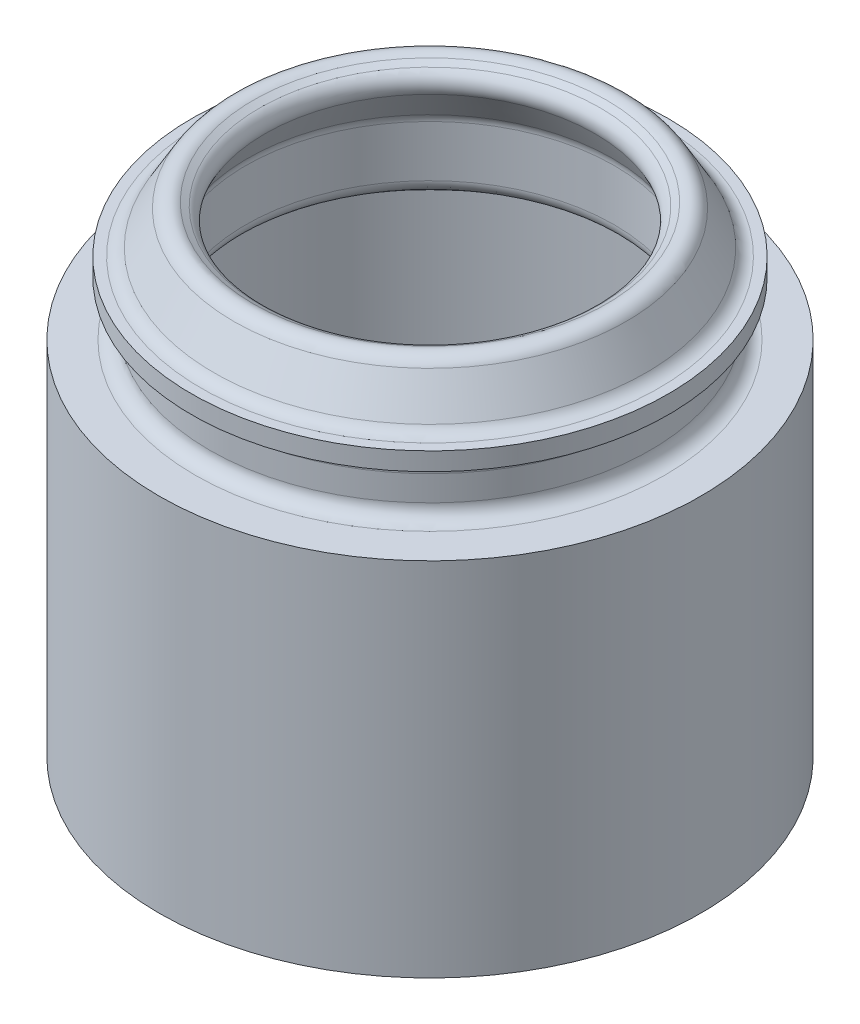
ISO-10303-21;
HEADER;
FILE_DESCRIPTION(('STEP AP214'),'2;1');
FILE_NAME('part.step','',(''),(''),'','','');
FILE_SCHEMA(('AUTOMOTIVE_DESIGN { 1 0 10303 214 1 1 1 1 }'));
ENDSEC;
DATA;
#1=APPLICATION_CONTEXT('core data for automotive mechanical design processes');
#2=APPLICATION_PROTOCOL_DEFINITION('international standard','automotive_design',2000,#1);
#3=PRODUCT_CONTEXT('',#1,'mechanical');
#4=PRODUCT('Part','Part','',(#3));
#5=PRODUCT_RELATED_PRODUCT_CATEGORY('part','',(#4));
#6=PRODUCT_DEFINITION_FORMATION('','',#4);
#7=PRODUCT_DEFINITION_CONTEXT('part definition',#1,'design');
#8=PRODUCT_DEFINITION('design','',#6,#7);
#9=PRODUCT_DEFINITION_SHAPE('','',#8);
#10=(LENGTH_UNIT() NAMED_UNIT(*) SI_UNIT(.MILLI.,.METRE.));
#11=(NAMED_UNIT(*) PLANE_ANGLE_UNIT() SI_UNIT($,.RADIAN.));
#12=(NAMED_UNIT(*) SI_UNIT($,.STERADIAN.) SOLID_ANGLE_UNIT());
#13=UNCERTAINTY_MEASURE_WITH_UNIT(LENGTH_MEASURE(1.E-05),#10,'distance_accuracy_value','');
#14=(GEOMETRIC_REPRESENTATION_CONTEXT(3) GLOBAL_UNCERTAINTY_ASSIGNED_CONTEXT((#13)) GLOBAL_UNIT_ASSIGNED_CONTEXT((#10,
#11,#12)) REPRESENTATION_CONTEXT('',''));
#15=CARTESIAN_POINT('',(0.,0.,0.));
#16=DIRECTION('',(0.,0.,1.));
#17=DIRECTION('',(1.,0.,0.));
#18=AXIS2_PLACEMENT_3D('',#15,#16,#17);
#19=CARTESIAN_POINT('',(0.,10.,0.));
#20=DIRECTION('',(0.,-1.,0.));
#21=DIRECTION('',(0.,0.,-1.));
#22=AXIS2_PLACEMENT_3D('',#19,#20,#21);
#23=CYLINDRICAL_SURFACE('',#22,7.5);
#24=CARTESIAN_POINT('',(0.,10.,0.));
#25=DIRECTION('',(0.,1.,0.));
#26=DIRECTION('',(0.,0.,1.));
#27=AXIS2_PLACEMENT_3D('',#24,#25,#26);
#28=CIRCLE('',#27,7.5);
#29=CARTESIAN_POINT('',(0.,10.,7.5));
#30=VERTEX_POINT('',#29);
#31=EDGE_CURVE('E50',#30,#30,#28,.T.);
#32=ORIENTED_EDGE('',*,*,#31,.F.);
#33=EDGE_LOOP('',(#32));
#34=FACE_BOUND('',#33,.T.);
#35=CARTESIAN_POINT('',(0.,0.,0.));
#36=DIRECTION('',(0.,1.,0.));
#37=DIRECTION('',(0.,0.,1.));
#38=AXIS2_PLACEMENT_3D('',#35,#36,#37);
#39=CIRCLE('',#38,7.5);
#40=CARTESIAN_POINT('',(0.,0.,7.5));
#41=VERTEX_POINT('',#40);
#42=EDGE_CURVE('E55',#41,#41,#39,.T.);
#43=ORIENTED_EDGE('',*,*,#42,.T.);
#44=EDGE_LOOP('',(#43));
#45=FACE_BOUND('',#44,.T.);
#46=ADVANCED_FACE('F43',(#34,#45),#23,.T.);
#47=CARTESIAN_POINT('',(0.,10.,0.));
#48=DIRECTION('',(0.,1.,0.));
#49=DIRECTION('',(0.,0.,1.));
#50=AXIS2_PLACEMENT_3D('',#47,#48,#49);
#51=PLANE('',#50);
#52=CARTESIAN_POINT('',(0.,10.,0.));
#53=DIRECTION('',(0.,1.,0.));
#54=DIRECTION('',(0.,0.,1.));
#55=AXIS2_PLACEMENT_3D('',#52,#53,#54);
#56=CIRCLE('',#55,6.5);
#57=CARTESIAN_POINT('',(0.,10.,6.5));
#58=VERTEX_POINT('',#57);
#59=EDGE_CURVE('E63',#58,#58,#56,.T.);
#60=ORIENTED_EDGE('',*,*,#59,.F.);
#61=EDGE_LOOP('',(#60));
#62=FACE_BOUND('',#61,.T.);
#63=ORIENTED_EDGE('',*,*,#31,.T.);
#64=EDGE_LOOP('',(#63));
#65=FACE_BOUND('',#64,.T.);
#66=ADVANCED_FACE('F225',(#62,#65),#51,.T.);
#67=CARTESIAN_POINT('',(0.,0.,0.));
#68=DIRECTION('',(0.,1.,0.));
#69=DIRECTION('',(0.,0.,1.));
#70=AXIS2_PLACEMENT_3D('',#67,#68,#69);
#71=PLANE('',#70);
#72=ORIENTED_EDGE('',*,*,#42,.F.);
#73=EDGE_LOOP('',(#72));
#74=FACE_BOUND('',#73,.T.);
#75=ADVANCED_FACE('F219',(#74),#71,.F.);
#76=CARTESIAN_POINT('',(0.,9.,0.));
#77=DIRECTION('',(0.,-1.,0.));
#78=DIRECTION('',(0.,0.,-1.));
#79=AXIS2_PLACEMENT_3D('',#76,#77,#78);
#80=CONICAL_SURFACE('',#79,6.5,0.950546840812076);
#81=CARTESIAN_POINT('',(0.,9.88035376963403,0.));
#82=DIRECTION('',(0.,-1.,0.));
#83=DIRECTION('',(0.,0.,-1.));
#84=AXIS2_PLACEMENT_3D('',#81,#82,#83);
#85=CIRCLE('',#84,5.26750472251236);
#86=CARTESIAN_POINT('',(0.,9.88035376963403,-5.26750472251236));
#87=VERTEX_POINT('',#86);
#88=EDGE_CURVE('E67',#87,#87,#85,.T.);
#89=ORIENTED_EDGE('',*,*,#88,.F.);
#90=EDGE_LOOP('',(#89));
#91=FACE_BOUND('',#90,.T.);
#92=CARTESIAN_POINT('',(0.,9.,0.));
#93=DIRECTION('',(0.,-1.,0.));
#94=DIRECTION('',(0.,0.,-1.));
#95=AXIS2_PLACEMENT_3D('',#92,#93,#94);
#96=CIRCLE('',#95,6.5);
#97=CARTESIAN_POINT('',(0.,9.,-6.5));
#98=VERTEX_POINT('',#97);
#99=EDGE_CURVE('E10',#98,#98,#96,.T.);
#100=ORIENTED_EDGE('',*,*,#99,.T.);
#101=EDGE_LOOP('',(#100));
#102=FACE_BOUND('',#101,.T.);
#103=ADVANCED_FACE('F214',(#91,#102),#80,.F.);
#104=CARTESIAN_POINT('',(0.,10.2058471581167,0.));
#105=DIRECTION('',(0.,-1.,0.));
#106=DIRECTION('',(0.,0.,-1.));
#107=AXIS2_PLACEMENT_3D('',#104,#105,#106);
#108=TOROIDAL_SURFACE('',#107,5.5,0.4);
#109=CARTESIAN_POINT('',(0.,10.2058471581167,0.));
#110=DIRECTION('',(0.,-1.,0.));
#111=DIRECTION('',(0.,0.,-1.));
#112=AXIS2_PLACEMENT_3D('',#109,#110,#111);
#113=CIRCLE('',#112,5.1);
#114=CARTESIAN_POINT('',(0.,10.2058471581167,-5.1));
#115=VERTEX_POINT('',#114);
#116=EDGE_CURVE('E74',#115,#115,#113,.T.);
#117=ORIENTED_EDGE('',*,*,#116,.F.);
#118=EDGE_LOOP('',(#117));
#119=FACE_BOUND('',#118,.T.);
#120=ORIENTED_EDGE('',*,*,#88,.T.);
#121=EDGE_LOOP('',(#120));
#122=FACE_BOUND('',#121,.T.);
#123=ADVANCED_FACE('F208',(#119,#122),#108,.T.);
#124=CARTESIAN_POINT('',(0.,1.5,0.));
#125=DIRECTION('',(0.,-1.,0.));
#126=DIRECTION('',(0.,0.,-1.));
#127=AXIS2_PLACEMENT_3D('',#124,#125,#126);
#128=CYLINDRICAL_SURFACE('',#127,5.1);
#129=CARTESIAN_POINT('',(0.,11.6248711305964,0.));
#130=DIRECTION('',(0.,-1.,0.));
#131=DIRECTION('',(0.,0.,-1.));
#132=AXIS2_PLACEMENT_3D('',#129,#130,#131);
#133=CIRCLE('',#132,5.1);
#134=CARTESIAN_POINT('',(0.,11.6248711305964,-5.1));
#135=VERTEX_POINT('',#134);
#136=EDGE_CURVE('E78',#135,#135,#133,.T.);
#137=ORIENTED_EDGE('',*,*,#136,.F.);
#138=EDGE_LOOP('',(#137));
#139=FACE_BOUND('',#138,.T.);
#140=ORIENTED_EDGE('',*,*,#116,.T.);
#141=EDGE_LOOP('',(#140));
#142=FACE_BOUND('',#141,.T.);
#143=ADVANCED_FACE('F202',(#139,#142),#128,.F.);
#144=CARTESIAN_POINT('',(0.,11.6248711305964,0.));
#145=DIRECTION('',(0.,-1.,0.));
#146=DIRECTION('',(0.,0.,-1.));
#147=AXIS2_PLACEMENT_3D('',#144,#145,#146);
#148=TOROIDAL_SURFACE('',#147,4.7,0.400000000000001);
#149=CARTESIAN_POINT('',(0.,11.8248711305964,0.));
#150=DIRECTION('',(0.,-1.,0.));
#151=DIRECTION('',(0.,0.,-1.));
#152=AXIS2_PLACEMENT_3D('',#149,#150,#151);
#153=CIRCLE('',#152,5.04641016151378);
#154=CARTESIAN_POINT('',(0.,11.8248711305964,-5.04641016151378));
#155=VERTEX_POINT('',#154);
#156=EDGE_CURVE('E82',#155,#155,#153,.T.);
#157=ORIENTED_EDGE('',*,*,#156,.F.);
#158=EDGE_LOOP('',(#157));
#159=FACE_BOUND('',#158,.T.);
#160=ORIENTED_EDGE('',*,*,#136,.T.);
#161=EDGE_LOOP('',(#160));
#162=FACE_BOUND('',#161,.T.);
#163=ADVANCED_FACE('F196',(#159,#162),#148,.F.);
#164=CARTESIAN_POINT('',(0.,11.8248711305964,0.));
#165=DIRECTION('',(0.,-1.,0.));
#166=DIRECTION('',(0.,0.,-1.));
#167=AXIS2_PLACEMENT_3D('',#164,#165,#166);
#168=CONICAL_SURFACE('',#167,5.04641016151378,0.523598775598297);
#169=CARTESIAN_POINT('',(0.,12.6535898384862,0.));
#170=DIRECTION('',(0.,-1.,0.));
#171=DIRECTION('',(0.,0.,-1.));
#172=AXIS2_PLACEMENT_3D('',#169,#170,#171);
#173=CIRCLE('',#172,4.56794919243113);
#174=CARTESIAN_POINT('',(0.,12.6535898384862,-4.56794919243113));
#175=VERTEX_POINT('',#174);
#176=EDGE_CURVE('E86',#175,#175,#173,.T.);
#177=ORIENTED_EDGE('',*,*,#176,.F.);
#178=EDGE_LOOP('',(#177));
#179=FACE_BOUND('',#178,.T.);
#180=ORIENTED_EDGE('',*,*,#156,.T.);
#181=EDGE_LOOP('',(#180));
#182=FACE_BOUND('',#181,.T.);
#183=ADVANCED_FACE('F190',(#179,#182),#168,.F.);
#184=CARTESIAN_POINT('',(0.,12.8535898384862,0.));
#185=DIRECTION('',(0.,-1.,0.));
#186=DIRECTION('',(0.,0.,-1.));
#187=AXIS2_PLACEMENT_3D('',#184,#185,#186);
#188=TOROIDAL_SURFACE('',#187,4.9143593539449,0.4);
#189=CARTESIAN_POINT('',(0.,13.2,0.));
#190=DIRECTION('',(0.,-1.,0.));
#191=DIRECTION('',(0.,0.,-1.));
#192=AXIS2_PLACEMENT_3D('',#189,#190,#191);
#193=CIRCLE('',#192,4.7143593539449);
#194=CARTESIAN_POINT('',(0.,13.2,-4.7143593539449));
#195=VERTEX_POINT('',#194);
#196=EDGE_CURVE('E90',#195,#195,#193,.T.);
#197=ORIENTED_EDGE('',*,*,#196,.F.);
#198=EDGE_LOOP('',(#197));
#199=FACE_BOUND('',#198,.T.);
#200=ORIENTED_EDGE('',*,*,#176,.T.);
#201=EDGE_LOOP('',(#200));
#202=FACE_BOUND('',#201,.T.);
#203=ADVANCED_FACE('F184',(#199,#202),#188,.T.);
#204=CARTESIAN_POINT('',(0.,13.2,0.));
#205=DIRECTION('',(0.,1.,0.));
#206=DIRECTION('',(0.,0.,1.));
#207=AXIS2_PLACEMENT_3D('',#204,#205,#206);
#208=CONICAL_SURFACE('',#207,4.7143593539449,1.0471975511966);
#209=CARTESIAN_POINT('',(0.,13.3,0.));
#210=DIRECTION('',(0.,-1.,0.));
#211=DIRECTION('',(0.,0.,-1.));
#212=AXIS2_PLACEMENT_3D('',#209,#210,#211);
#213=CIRCLE('',#212,4.88756443470179);
#214=CARTESIAN_POINT('',(0.,13.3,-4.88756443470179));
#215=VERTEX_POINT('',#214);
#216=EDGE_CURVE('E94',#215,#215,#213,.T.);
#217=ORIENTED_EDGE('',*,*,#216,.F.);
#218=EDGE_LOOP('',(#217));
#219=FACE_BOUND('',#218,.T.);
#220=ORIENTED_EDGE('',*,*,#196,.T.);
#221=EDGE_LOOP('',(#220));
#222=FACE_BOUND('',#221,.T.);
#223=ADVANCED_FACE('F178',(#219,#222),#208,.F.);
#224=CARTESIAN_POINT('',(0.,12.9535898384862,0.));
#225=DIRECTION('',(0.,-1.,0.));
#226=DIRECTION('',(0.,0.,-1.));
#227=AXIS2_PLACEMENT_3D('',#224,#225,#226);
#228=TOROIDAL_SURFACE('',#227,5.08756443470179,0.4);
#229=CARTESIAN_POINT('',(0.,13.1535898384862,0.));
#230=DIRECTION('',(0.,-1.,0.));
#231=DIRECTION('',(0.,0.,-1.));
#232=AXIS2_PLACEMENT_3D('',#229,#230,#231);
#233=CIRCLE('',#232,5.43397459621557);
#234=CARTESIAN_POINT('',(0.,13.1535898384862,-5.43397459621557));
#235=VERTEX_POINT('',#234);
#236=EDGE_CURVE('E98',#235,#235,#233,.T.);
#237=ORIENTED_EDGE('',*,*,#236,.F.);
#238=EDGE_LOOP('',(#237));
#239=FACE_BOUND('',#238,.T.);
#240=ORIENTED_EDGE('',*,*,#216,.T.);
#241=EDGE_LOOP('',(#240));
#242=FACE_BOUND('',#241,.T.);
#243=ADVANCED_FACE('F172',(#239,#242),#228,.T.);
#244=CARTESIAN_POINT('',(0.,13.1535898384862,0.));
#245=DIRECTION('',(0.,-1.,0.));
#246=DIRECTION('',(0.,0.,-1.));
#247=AXIS2_PLACEMENT_3D('',#244,#245,#246);
#248=CONICAL_SURFACE('',#247,5.43397459621557,0.523598775598297);
#249=CARTESIAN_POINT('',(0.,12.2,0.));
#250=DIRECTION('',(0.,-1.,0.));
#251=DIRECTION('',(0.,0.,-1.));
#252=AXIS2_PLACEMENT_3D('',#249,#250,#251);
#253=CIRCLE('',#252,5.98452994616208);
#254=CARTESIAN_POINT('',(0.,12.2,-5.98452994616208));
#255=VERTEX_POINT('',#254);
#256=EDGE_CURVE('E102',#255,#255,#253,.T.);
#257=ORIENTED_EDGE('',*,*,#256,.F.);
#258=EDGE_LOOP('',(#257));
#259=FACE_BOUND('',#258,.T.);
#260=ORIENTED_EDGE('',*,*,#236,.T.);
#261=EDGE_LOOP('',(#260));
#262=FACE_BOUND('',#261,.T.);
#263=ADVANCED_FACE('F166',(#259,#262),#248,.T.);
#264=CARTESIAN_POINT('',(0.,12.4,0.));
#265=DIRECTION('',(0.,-1.,0.));
#266=DIRECTION('',(0.,0.,-1.));
#267=AXIS2_PLACEMENT_3D('',#264,#265,#266);
#268=TOROIDAL_SURFACE('',#267,6.33094010767585,0.399999999999999);
#269=CARTESIAN_POINT('',(0.,12.,0.));
#270=DIRECTION('',(0.,-1.,0.));
#271=DIRECTION('',(0.,0.,-1.));
#272=AXIS2_PLACEMENT_3D('',#269,#270,#271);
#273=CIRCLE('',#272,6.33094010767585);
#274=CARTESIAN_POINT('',(0.,12.,-6.33094010767585));
#275=VERTEX_POINT('',#274);
#276=EDGE_CURVE('E106',#275,#275,#273,.T.);
#277=ORIENTED_EDGE('',*,*,#276,.F.);
#278=EDGE_LOOP('',(#277));
#279=FACE_BOUND('',#278,.T.);
#280=ORIENTED_EDGE('',*,*,#256,.T.);
#281=EDGE_LOOP('',(#280));
#282=FACE_BOUND('',#281,.T.);
#283=ADVANCED_FACE('F160',(#279,#282),#268,.F.);
#284=CARTESIAN_POINT('',(-6.6,12.,0.));
#285=DIRECTION('',(0.,-1.,0.));
#286=DIRECTION('',(0.,0.,-1.));
#287=AXIS2_PLACEMENT_3D('',#284,#285,#286);
#288=PLANE('',#287);
#289=CARTESIAN_POINT('',(0.,12.,0.));
#290=DIRECTION('',(0.,-1.,0.));
#291=DIRECTION('',(0.,0.,-1.));
#292=AXIS2_PLACEMENT_3D('',#289,#290,#291);
#293=CIRCLE('',#292,6.6);
#294=CARTESIAN_POINT('',(0.,12.,-6.6));
#295=VERTEX_POINT('',#294);
#296=EDGE_CURVE('E110',#295,#295,#293,.T.);
#297=ORIENTED_EDGE('',*,*,#296,.F.);
#298=EDGE_LOOP('',(#297));
#299=FACE_BOUND('',#298,.T.);
#300=ORIENTED_EDGE('',*,*,#276,.T.);
#301=EDGE_LOOP('',(#300));
#302=FACE_BOUND('',#301,.T.);
#303=ADVANCED_FACE('F154',(#299,#302),#288,.F.);
#304=CARTESIAN_POINT('',(0.,1.5,0.));
#305=DIRECTION('',(0.,-1.,0.));
#306=DIRECTION('',(0.,0.,-1.));
#307=AXIS2_PLACEMENT_3D('',#304,#305,#306);
#308=CYLINDRICAL_SURFACE('',#307,6.6);
#309=CARTESIAN_POINT('',(0.,11.5,0.));
#310=DIRECTION('',(0.,-1.,0.));
#311=DIRECTION('',(0.,0.,-1.));
#312=AXIS2_PLACEMENT_3D('',#309,#310,#311);
#313=CIRCLE('',#312,6.6);
#314=CARTESIAN_POINT('',(0.,11.5,-6.6));
#315=VERTEX_POINT('',#314);
#316=EDGE_CURVE('E114',#315,#315,#313,.T.);
#317=ORIENTED_EDGE('',*,*,#316,.F.);
#318=EDGE_LOOP('',(#317));
#319=FACE_BOUND('',#318,.T.);
#320=ORIENTED_EDGE('',*,*,#296,.T.);
#321=EDGE_LOOP('',(#320));
#322=FACE_BOUND('',#321,.T.);
#323=ADVANCED_FACE('F148',(#319,#322),#308,.T.);
#324=CARTESIAN_POINT('',(-6.5,11.5,0.));
#325=DIRECTION('',(0.,1.,0.));
#326=DIRECTION('',(0.,0.,1.));
#327=AXIS2_PLACEMENT_3D('',#324,#325,#326);
#328=PLANE('',#327);
#329=CARTESIAN_POINT('',(0.,11.5,0.));
#330=DIRECTION('',(0.,-1.,0.));
#331=DIRECTION('',(0.,0.,-1.));
#332=AXIS2_PLACEMENT_3D('',#329,#330,#331);
#333=CIRCLE('',#332,6.5);
#334=CARTESIAN_POINT('',(0.,11.5,-6.5));
#335=VERTEX_POINT('',#334);
#336=EDGE_CURVE('E118',#335,#335,#333,.T.);
#337=ORIENTED_EDGE('',*,*,#336,.F.);
#338=EDGE_LOOP('',(#337));
#339=FACE_BOUND('',#338,.T.);
#340=ORIENTED_EDGE('',*,*,#316,.T.);
#341=EDGE_LOOP('',(#340));
#342=FACE_BOUND('',#341,.T.);
#343=ADVANCED_FACE('F142',(#339,#342),#328,.F.);
#344=CARTESIAN_POINT('',(0.,11.1,0.));
#345=DIRECTION('',(0.,-1.,0.));
#346=DIRECTION('',(0.,0.,-1.));
#347=AXIS2_PLACEMENT_3D('',#344,#345,#346);
#348=TOROIDAL_SURFACE('',#347,6.5,0.4);
#349=CARTESIAN_POINT('',(0.,11.1,0.));
#350=DIRECTION('',(0.,-1.,0.));
#351=DIRECTION('',(0.,0.,-1.));
#352=AXIS2_PLACEMENT_3D('',#349,#350,#351);
#353=CIRCLE('',#352,6.1);
#354=CARTESIAN_POINT('',(0.,11.1,-6.1));
#355=VERTEX_POINT('',#354);
#356=EDGE_CURVE('E122',#355,#355,#353,.T.);
#357=ORIENTED_EDGE('',*,*,#356,.F.);
#358=EDGE_LOOP('',(#357));
#359=FACE_BOUND('',#358,.T.);
#360=ORIENTED_EDGE('',*,*,#336,.T.);
#361=EDGE_LOOP('',(#360));
#362=FACE_BOUND('',#361,.T.);
#363=ADVANCED_FACE('F136',(#359,#362),#348,.F.);
#364=CARTESIAN_POINT('',(0.,1.5,0.));
#365=DIRECTION('',(0.,-1.,0.));
#366=DIRECTION('',(0.,0.,-1.));
#367=AXIS2_PLACEMENT_3D('',#364,#365,#366);
#368=CYLINDRICAL_SURFACE('',#367,6.1);
#369=CARTESIAN_POINT('',(0.,10.4,0.));
#370=DIRECTION('',(0.,-1.,0.));
#371=DIRECTION('',(0.,0.,-1.));
#372=AXIS2_PLACEMENT_3D('',#369,#370,#371);
#373=CIRCLE('',#372,6.1);
#374=CARTESIAN_POINT('',(0.,10.4,-6.1));
#375=VERTEX_POINT('',#374);
#376=EDGE_CURVE('E126',#375,#375,#373,.T.);
#377=ORIENTED_EDGE('',*,*,#376,.F.);
#378=EDGE_LOOP('',(#377));
#379=FACE_BOUND('',#378,.T.);
#380=ORIENTED_EDGE('',*,*,#356,.T.);
#381=EDGE_LOOP('',(#380));
#382=FACE_BOUND('',#381,.T.);
#383=ADVANCED_FACE('F133',(#379,#382),#368,.T.);
#384=CARTESIAN_POINT('',(0.,10.4,0.));
#385=DIRECTION('',(0.,-1.,0.));
#386=DIRECTION('',(0.,0.,-1.));
#387=AXIS2_PLACEMENT_3D('',#384,#385,#386);
#388=TOROIDAL_SURFACE('',#387,6.5,0.4);
#389=ORIENTED_EDGE('',*,*,#59,.T.);
#390=EDGE_LOOP('',(#389));
#391=FACE_BOUND('',#390,.T.);
#392=ORIENTED_EDGE('',*,*,#376,.T.);
#393=EDGE_LOOP('',(#392));
#394=FACE_BOUND('',#393,.T.);
#395=ADVANCED_FACE('F131',(#391,#394),#388,.F.);
#396=CARTESIAN_POINT('',(0.,1.5,0.));
#397=DIRECTION('',(0.,1.,0.));
#398=DIRECTION('',(0.,0.,1.));
#399=AXIS2_PLACEMENT_3D('',#396,#397,#398);
#400=PLANE('',#399);
#401=CARTESIAN_POINT('',(0.,1.5,0.));
#402=DIRECTION('',(0.,1.,0.));
#403=DIRECTION('',(0.,0.,1.));
#404=AXIS2_PLACEMENT_3D('',#401,#402,#403);
#405=CIRCLE('',#404,6.5);
#406=CARTESIAN_POINT('',(0.,1.5,6.5));
#407=VERTEX_POINT('',#406);
#408=EDGE_CURVE('E61',#407,#407,#405,.T.);
#409=ORIENTED_EDGE('',*,*,#408,.T.);
#410=EDGE_LOOP('',(#409));
#411=FACE_BOUND('',#410,.T.);
#412=ADVANCED_FACE('F243',(#411),#400,.T.);
#413=CARTESIAN_POINT('',(0.,1.5,0.));
#414=DIRECTION('',(0.,1.,0.));
#415=DIRECTION('',(0.,0.,1.));
#416=AXIS2_PLACEMENT_3D('',#413,#414,#415);
#417=CYLINDRICAL_SURFACE('',#416,6.5);
#418=ORIENTED_EDGE('',*,*,#408,.F.);
#419=EDGE_LOOP('',(#418));
#420=FACE_BOUND('',#419,.T.);
#421=ORIENTED_EDGE('',*,*,#99,.F.);
#422=EDGE_LOOP('',(#421));
#423=FACE_BOUND('',#422,.T.);
#424=ADVANCED_FACE('F241',(#420,#423),#417,.F.);
#425=CLOSED_SHELL('',(#46,#66,#75,#103,#123,#143,#163,#183,#203,#223,#243,#263,#283,#303,#323,
#343,#363,#383,#395,#412,#424));
#426=MANIFOLD_SOLID_BREP('B2',#425);
#427=ADVANCED_BREP_SHAPE_REPRESENTATION('',(#18,#426),#14);
#428=SHAPE_DEFINITION_REPRESENTATION(#9,#427);
ENDSEC;
END-ISO-10303-21;
